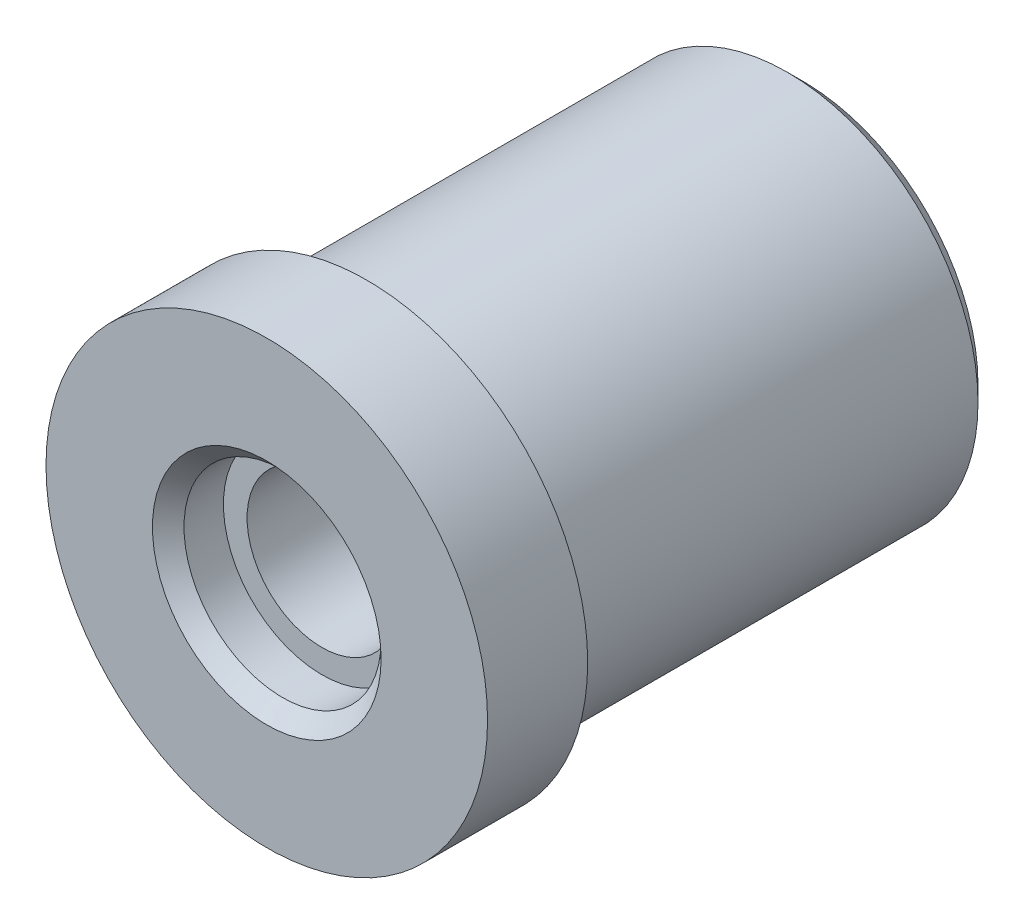
ISO-10303-21;
HEADER;
FILE_DESCRIPTION(('STEP AP214'),'2;1');
FILE_NAME('part.step','',(''),(''),'','','');
FILE_SCHEMA(('AUTOMOTIVE_DESIGN { 1 0 10303 214 1 1 1 1 }'));
ENDSEC;
DATA;
#1=APPLICATION_CONTEXT('core data for automotive mechanical design processes');
#2=APPLICATION_PROTOCOL_DEFINITION('international standard','automotive_design',2000,#1);
#3=PRODUCT_CONTEXT('',#1,'mechanical');
#4=PRODUCT('Part','Part','',(#3));
#5=PRODUCT_RELATED_PRODUCT_CATEGORY('part','',(#4));
#6=PRODUCT_DEFINITION_FORMATION('','',#4);
#7=PRODUCT_DEFINITION_CONTEXT('part definition',#1,'design');
#8=PRODUCT_DEFINITION('design','',#6,#7);
#9=PRODUCT_DEFINITION_SHAPE('','',#8);
#10=(LENGTH_UNIT() NAMED_UNIT(*) SI_UNIT(.MILLI.,.METRE.));
#11=(NAMED_UNIT(*) PLANE_ANGLE_UNIT() SI_UNIT($,.RADIAN.));
#12=(NAMED_UNIT(*) SI_UNIT($,.STERADIAN.) SOLID_ANGLE_UNIT());
#13=UNCERTAINTY_MEASURE_WITH_UNIT(LENGTH_MEASURE(1.E-05),#10,'distance_accuracy_value','');
#14=(GEOMETRIC_REPRESENTATION_CONTEXT(3) GLOBAL_UNCERTAINTY_ASSIGNED_CONTEXT((#13)) GLOBAL_UNIT_ASSIGNED_CONTEXT((#10,
#11,#12)) REPRESENTATION_CONTEXT('',''));
#15=CARTESIAN_POINT('',(0.,0.,0.));
#16=DIRECTION('',(0.,0.,1.));
#17=DIRECTION('',(1.,0.,0.));
#18=AXIS2_PLACEMENT_3D('',#15,#16,#17);
#19=CARTESIAN_POINT('',(0.,0.,17.));
#20=DIRECTION('',(0.,0.,-1.));
#21=DIRECTION('',(-1.,0.,0.));
#22=AXIS2_PLACEMENT_3D('',#19,#20,#21);
#23=CYLINDRICAL_SURFACE('',#22,12.1);
#24=CARTESIAN_POINT('',(0.,0.,-16.));
#25=DIRECTION('',(0.,0.,1.));
#26=DIRECTION('',(1.,0.,0.));
#27=AXIS2_PLACEMENT_3D('',#24,#25,#26);
#28=CIRCLE('',#27,12.1);
#29=CARTESIAN_POINT('',(12.1,0.,-16.));
#30=VERTEX_POINT('',#29);
#31=EDGE_CURVE('E79',#30,#30,#28,.T.);
#32=ORIENTED_EDGE('',*,*,#31,.T.);
#33=EDGE_LOOP('',(#32));
#34=FACE_BOUND('',#33,.T.);
#35=CARTESIAN_POINT('',(0.,0.,10.65));
#36=DIRECTION('',(0.,0.,1.));
#37=DIRECTION('',(1.,0.,0.));
#38=AXIS2_PLACEMENT_3D('',#35,#36,#37);
#39=CIRCLE('',#38,12.1);
#40=CARTESIAN_POINT('',(12.1,0.,10.65));
#41=VERTEX_POINT('',#40);
#42=EDGE_CURVE('E83',#41,#41,#39,.T.);
#43=ORIENTED_EDGE('',*,*,#42,.F.);
#44=EDGE_LOOP('',(#43));
#45=FACE_BOUND('',#44,.T.);
#46=ADVANCED_FACE('F48',(#34,#45),#23,.T.);
#47=CARTESIAN_POINT('',(0.,0.,-17.));
#48=DIRECTION('',(0.,0.,1.));
#49=DIRECTION('',(1.,0.,0.));
#50=AXIS2_PLACEMENT_3D('',#47,#48,#49);
#51=CYLINDRICAL_SURFACE('',#50,4.75);
#52=CARTESIAN_POINT('',(0.,0.,13.5));
#53=DIRECTION('',(0.,0.,1.));
#54=DIRECTION('',(1.,0.,0.));
#55=AXIS2_PLACEMENT_3D('',#52,#53,#54);
#56=CIRCLE('',#55,4.75);
#57=CARTESIAN_POINT('',(4.75,0.,13.5));
#58=VERTEX_POINT('',#57);
#59=EDGE_CURVE('E87',#58,#58,#56,.F.);
#60=ORIENTED_EDGE('',*,*,#59,.F.);
#61=EDGE_LOOP('',(#60));
#62=FACE_BOUND('',#61,.T.);
#63=CARTESIAN_POINT('',(0.,0.,-13.5));
#64=DIRECTION('',(0.,0.,-1.));
#65=DIRECTION('',(-1.,0.,0.));
#66=AXIS2_PLACEMENT_3D('',#63,#64,#65);
#67=CIRCLE('',#66,4.75);
#68=CARTESIAN_POINT('',(-4.75,0.,-13.5));
#69=VERTEX_POINT('',#68);
#70=EDGE_CURVE('E88',#69,#69,#67,.F.);
#71=ORIENTED_EDGE('',*,*,#70,.F.);
#72=EDGE_LOOP('',(#71));
#73=FACE_BOUND('',#72,.T.);
#74=ADVANCED_FACE('F130',(#62,#73),#51,.F.);
#75=CARTESIAN_POINT('',(0.,0.,17.));
#76=DIRECTION('',(0.,0.,1.));
#77=DIRECTION('',(1.,0.,0.));
#78=AXIS2_PLACEMENT_3D('',#75,#76,#77);
#79=PLANE('',#78);
#80=CARTESIAN_POINT('',(0.,0.,17.));
#81=DIRECTION('',(0.,0.,1.));
#82=DIRECTION('',(1.,0.,0.));
#83=AXIS2_PLACEMENT_3D('',#80,#81,#82);
#84=CIRCLE('',#83,7.25);
#85=CARTESIAN_POINT('',(7.25,0.,17.));
#86=VERTEX_POINT('',#85);
#87=EDGE_CURVE('E10',#86,#86,#84,.F.);
#88=ORIENTED_EDGE('',*,*,#87,.T.);
#89=EDGE_LOOP('',(#88));
#90=FACE_BOUND('',#89,.T.);
#91=CARTESIAN_POINT('',(0.,0.,17.));
#92=DIRECTION('',(0.,0.,1.));
#93=DIRECTION('',(1.,0.,0.));
#94=AXIS2_PLACEMENT_3D('',#91,#92,#93);
#95=CIRCLE('',#94,14.);
#96=CARTESIAN_POINT('',(14.,0.,17.));
#97=VERTEX_POINT('',#96);
#98=EDGE_CURVE('E104',#97,#97,#95,.T.);
#99=ORIENTED_EDGE('',*,*,#98,.T.);
#100=EDGE_LOOP('',(#99));
#101=FACE_BOUND('',#100,.T.);
#102=ADVANCED_FACE('F135',(#90,#101),#79,.T.);
#103=CARTESIAN_POINT('',(0.,0.,-17.));
#104=DIRECTION('',(0.,0.,1.));
#105=DIRECTION('',(1.,0.,0.));
#106=AXIS2_PLACEMENT_3D('',#103,#104,#105);
#107=PLANE('',#106);
#108=CARTESIAN_POINT('',(0.,0.,-17.));
#109=DIRECTION('',(0.,0.,1.));
#110=DIRECTION('',(1.,0.,0.));
#111=AXIS2_PLACEMENT_3D('',#108,#109,#110);
#112=CIRCLE('',#111,11.1);
#113=CARTESIAN_POINT('',(11.1,0.,-17.));
#114=VERTEX_POINT('',#113);
#115=EDGE_CURVE('E71',#114,#114,#112,.F.);
#116=ORIENTED_EDGE('',*,*,#115,.T.);
#117=EDGE_LOOP('',(#116));
#118=FACE_BOUND('',#117,.T.);
#119=CARTESIAN_POINT('',(0.,0.,-17.));
#120=DIRECTION('',(0.,0.,1.));
#121=DIRECTION('',(1.,0.,0.));
#122=AXIS2_PLACEMENT_3D('',#119,#120,#121);
#123=CIRCLE('',#122,7.25);
#124=CARTESIAN_POINT('',(7.25,0.,-17.));
#125=VERTEX_POINT('',#124);
#126=EDGE_CURVE('E76',#125,#125,#123,.T.);
#127=ORIENTED_EDGE('',*,*,#126,.T.);
#128=EDGE_LOOP('',(#127));
#129=FACE_BOUND('',#128,.T.);
#130=ADVANCED_FACE('F140',(#118,#129),#107,.F.);
#131=CARTESIAN_POINT('',(0.,0.,13.5));
#132=DIRECTION('',(0.,0.,1.));
#133=DIRECTION('',(1.,0.,0.));
#134=AXIS2_PLACEMENT_3D('',#131,#132,#133);
#135=PLANE('',#134);
#136=CARTESIAN_POINT('',(0.,0.,13.5));
#137=DIRECTION('',(0.,0.,1.));
#138=DIRECTION('',(1.,0.,0.));
#139=AXIS2_PLACEMENT_3D('',#136,#137,#138);
#140=CIRCLE('',#139,6.25);
#141=CARTESIAN_POINT('',(6.25,0.,13.5));
#142=VERTEX_POINT('',#141);
#143=EDGE_CURVE('E92',#142,#142,#140,.T.);
#144=ORIENTED_EDGE('',*,*,#143,.T.);
#145=EDGE_LOOP('',(#144));
#146=FACE_BOUND('',#145,.T.);
#147=ORIENTED_EDGE('',*,*,#59,.T.);
#148=EDGE_LOOP('',(#147));
#149=FACE_BOUND('',#148,.T.);
#150=ADVANCED_FACE('F158',(#146,#149),#135,.T.);
#151=CARTESIAN_POINT('',(0.,0.,13.5));
#152=DIRECTION('',(0.,0.,1.));
#153=DIRECTION('',(1.,0.,0.));
#154=AXIS2_PLACEMENT_3D('',#151,#152,#153);
#155=CYLINDRICAL_SURFACE('',#154,6.25);
#156=CARTESIAN_POINT('',(0.,0.,16.));
#157=DIRECTION('',(0.,0.,1.));
#158=DIRECTION('',(1.,0.,0.));
#159=AXIS2_PLACEMENT_3D('',#156,#157,#158);
#160=CIRCLE('',#159,6.25);
#161=CARTESIAN_POINT('',(6.25,0.,16.));
#162=VERTEX_POINT('',#161);
#163=EDGE_CURVE('E57',#162,#162,#160,.T.);
#164=ORIENTED_EDGE('',*,*,#163,.T.);
#165=EDGE_LOOP('',(#164));
#166=FACE_BOUND('',#165,.T.);
#167=ORIENTED_EDGE('',*,*,#143,.F.);
#168=EDGE_LOOP('',(#167));
#169=FACE_BOUND('',#168,.T.);
#170=ADVANCED_FACE('F163',(#166,#169),#155,.F.);
#171=CARTESIAN_POINT('',(0.,0.,-13.5));
#172=DIRECTION('',(0.,0.,-1.));
#173=DIRECTION('',(1.,0.,0.));
#174=AXIS2_PLACEMENT_3D('',#171,#172,#173);
#175=PLANE('',#174);
#176=CARTESIAN_POINT('',(0.,0.,-13.5));
#177=DIRECTION('',(0.,0.,1.));
#178=DIRECTION('',(1.,0.,0.));
#179=AXIS2_PLACEMENT_3D('',#176,#177,#178);
#180=CIRCLE('',#179,6.25);
#181=CARTESIAN_POINT('',(6.25,0.,-13.5));
#182=VERTEX_POINT('',#181);
#183=EDGE_CURVE('E93',#182,#182,#180,.T.);
#184=ORIENTED_EDGE('',*,*,#183,.F.);
#185=EDGE_LOOP('',(#184));
#186=FACE_BOUND('',#185,.T.);
#187=ORIENTED_EDGE('',*,*,#70,.T.);
#188=EDGE_LOOP('',(#187));
#189=FACE_BOUND('',#188,.T.);
#190=ADVANCED_FACE('F173',(#186,#189),#175,.T.);
#191=CARTESIAN_POINT('',(0.,0.,-13.5));
#192=DIRECTION('',(0.,0.,-1.));
#193=DIRECTION('',(-1.,0.,0.));
#194=AXIS2_PLACEMENT_3D('',#191,#192,#193);
#195=CYLINDRICAL_SURFACE('',#194,6.25);
#196=CARTESIAN_POINT('',(0.,0.,-16.));
#197=DIRECTION('',(0.,0.,1.));
#198=DIRECTION('',(1.,0.,0.));
#199=AXIS2_PLACEMENT_3D('',#196,#197,#198);
#200=CIRCLE('',#199,6.25);
#201=CARTESIAN_POINT('',(6.25,0.,-16.));
#202=VERTEX_POINT('',#201);
#203=EDGE_CURVE('E64',#202,#202,#200,.F.);
#204=ORIENTED_EDGE('',*,*,#203,.T.);
#205=EDGE_LOOP('',(#204));
#206=FACE_BOUND('',#205,.T.);
#207=ORIENTED_EDGE('',*,*,#183,.T.);
#208=EDGE_LOOP('',(#207));
#209=FACE_BOUND('',#208,.T.);
#210=ADVANCED_FACE('F127',(#206,#209),#195,.F.);
#211=CARTESIAN_POINT('',(0.,0.,10.65));
#212=DIRECTION('',(0.,0.,1.));
#213=DIRECTION('',(1.,0.,0.));
#214=AXIS2_PLACEMENT_3D('',#211,#212,#213);
#215=CYLINDRICAL_SURFACE('',#214,14.);
#216=CARTESIAN_POINT('',(0.,0.,10.65));
#217=DIRECTION('',(0.,0.,1.));
#218=DIRECTION('',(1.,0.,0.));
#219=AXIS2_PLACEMENT_3D('',#216,#217,#218);
#220=CIRCLE('',#219,14.);
#221=CARTESIAN_POINT('',(14.,0.,10.65));
#222=VERTEX_POINT('',#221);
#223=EDGE_CURVE('E103',#222,#222,#220,.T.);
#224=ORIENTED_EDGE('',*,*,#223,.T.);
#225=EDGE_LOOP('',(#224));
#226=FACE_BOUND('',#225,.T.);
#227=ORIENTED_EDGE('',*,*,#98,.F.);
#228=EDGE_LOOP('',(#227));
#229=FACE_BOUND('',#228,.T.);
#230=ADVANCED_FACE('F113',(#226,#229),#215,.T.);
#231=CARTESIAN_POINT('',(0.,0.,10.65));
#232=DIRECTION('',(0.,0.,1.));
#233=DIRECTION('',(1.,0.,0.));
#234=AXIS2_PLACEMENT_3D('',#231,#232,#233);
#235=PLANE('',#234);
#236=ORIENTED_EDGE('',*,*,#42,.T.);
#237=EDGE_LOOP('',(#236));
#238=FACE_BOUND('',#237,.T.);
#239=ORIENTED_EDGE('',*,*,#223,.F.);
#240=EDGE_LOOP('',(#239));
#241=FACE_BOUND('',#240,.T.);
#242=ADVANCED_FACE('F116',(#238,#241),#235,.F.);
#243=CARTESIAN_POINT('',(0.,0.,-16.));
#244=DIRECTION('',(0.,0.,1.));
#245=DIRECTION('',(1.,0.,0.));
#246=AXIS2_PLACEMENT_3D('',#243,#244,#245);
#247=CONICAL_SURFACE('',#246,12.1,0.785398163397448);
#248=ORIENTED_EDGE('',*,*,#115,.F.);
#249=EDGE_LOOP('',(#248));
#250=FACE_BOUND('',#249,.T.);
#251=ORIENTED_EDGE('',*,*,#31,.F.);
#252=EDGE_LOOP('',(#251));
#253=FACE_BOUND('',#252,.T.);
#254=ADVANCED_FACE('F118',(#250,#253),#247,.T.);
#255=CARTESIAN_POINT('',(0.,0.,-17.));
#256=DIRECTION('',(0.,0.,-1.));
#257=DIRECTION('',(-1.,0.,0.));
#258=AXIS2_PLACEMENT_3D('',#255,#256,#257);
#259=CONICAL_SURFACE('',#258,7.25,0.785398163397446);
#260=ORIENTED_EDGE('',*,*,#203,.F.);
#261=EDGE_LOOP('',(#260));
#262=FACE_BOUND('',#261,.T.);
#263=ORIENTED_EDGE('',*,*,#126,.F.);
#264=EDGE_LOOP('',(#263));
#265=FACE_BOUND('',#264,.T.);
#266=ADVANCED_FACE('F124',(#262,#265),#259,.F.);
#267=CARTESIAN_POINT('',(0.,0.,16.));
#268=DIRECTION('',(0.,0.,1.));
#269=DIRECTION('',(1.,0.,0.));
#270=AXIS2_PLACEMENT_3D('',#267,#268,#269);
#271=CONICAL_SURFACE('',#270,6.25,0.785398163397451);
#272=ORIENTED_EDGE('',*,*,#87,.F.);
#273=EDGE_LOOP('',(#272));
#274=FACE_BOUND('',#273,.T.);
#275=ORIENTED_EDGE('',*,*,#163,.F.);
#276=EDGE_LOOP('',(#275));
#277=FACE_BOUND('',#276,.T.);
#278=ADVANCED_FACE('F51',(#274,#277),#271,.F.);
#279=CLOSED_SHELL('',(#46,#74,#102,#130,#150,#170,#190,#210,#230,#242,#254,#266,#278));
#280=MANIFOLD_SOLID_BREP('B2',#279);
#281=ADVANCED_BREP_SHAPE_REPRESENTATION('',(#18,#280),#14);
#282=SHAPE_DEFINITION_REPRESENTATION(#9,#281);
ENDSEC;
END-ISO-10303-21;
